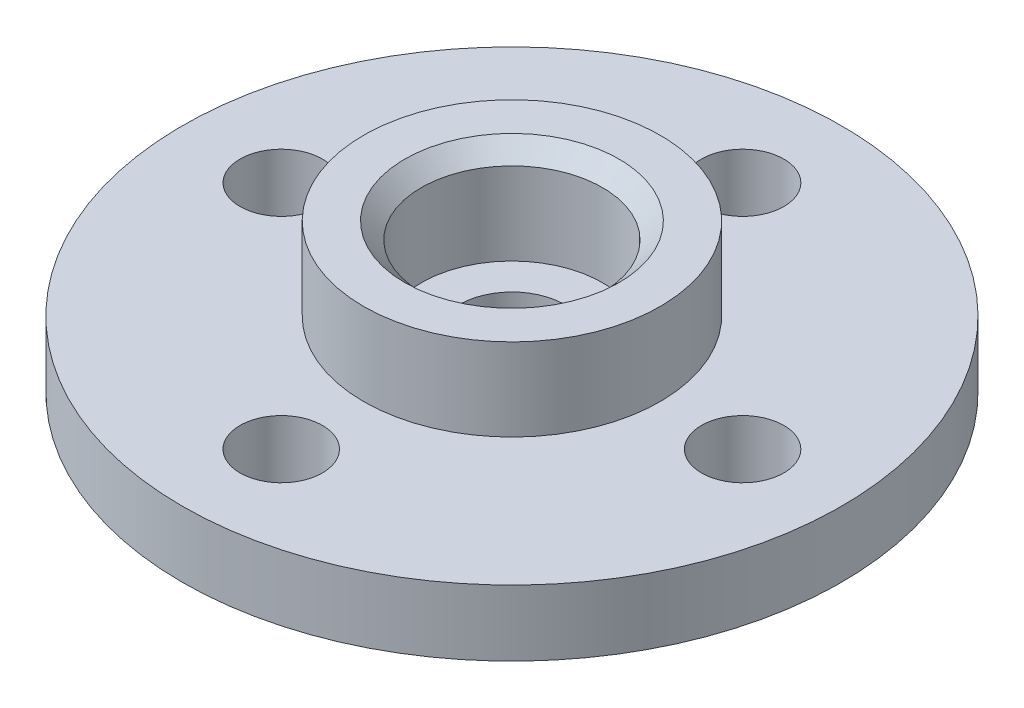
ISO-10303-21;
HEADER;
FILE_DESCRIPTION(('STEP AP214'),'2;1');
FILE_NAME('part.step','',(''),(''),'','','');
FILE_SCHEMA(('AUTOMOTIVE_DESIGN { 1 0 10303 214 1 1 1 1 }'));
ENDSEC;
DATA;
#1=APPLICATION_CONTEXT('core data for automotive mechanical design processes');
#2=APPLICATION_PROTOCOL_DEFINITION('international standard','automotive_design',2000,#1);
#3=PRODUCT_CONTEXT('',#1,'mechanical');
#4=PRODUCT('Part','Part','',(#3));
#5=PRODUCT_RELATED_PRODUCT_CATEGORY('part','',(#4));
#6=PRODUCT_DEFINITION_FORMATION('','',#4);
#7=PRODUCT_DEFINITION_CONTEXT('part definition',#1,'design');
#8=PRODUCT_DEFINITION('design','',#6,#7);
#9=PRODUCT_DEFINITION_SHAPE('','',#8);
#10=(LENGTH_UNIT() NAMED_UNIT(*) SI_UNIT(.MILLI.,.METRE.));
#11=(NAMED_UNIT(*) PLANE_ANGLE_UNIT() SI_UNIT($,.RADIAN.));
#12=(NAMED_UNIT(*) SI_UNIT($,.STERADIAN.) SOLID_ANGLE_UNIT());
#13=UNCERTAINTY_MEASURE_WITH_UNIT(LENGTH_MEASURE(1.E-05),#10,'distance_accuracy_value','');
#14=(GEOMETRIC_REPRESENTATION_CONTEXT(3) GLOBAL_UNCERTAINTY_ASSIGNED_CONTEXT((#13)) GLOBAL_UNIT_ASSIGNED_CONTEXT((#10,
#11,#12)) REPRESENTATION_CONTEXT('',''));
#15=CARTESIAN_POINT('',(0.,0.,0.));
#16=DIRECTION('',(0.,0.,1.));
#17=DIRECTION('',(1.,0.,0.));
#18=AXIS2_PLACEMENT_3D('',#15,#16,#17);
#19=CARTESIAN_POINT('',(0.,2.,0.));
#20=DIRECTION('',(0.,-1.,0.));
#21=DIRECTION('',(0.,0.,-1.));
#22=AXIS2_PLACEMENT_3D('',#19,#20,#21);
#23=CYLINDRICAL_SURFACE('',#22,10.);
#24=CARTESIAN_POINT('',(0.,2.,0.));
#25=DIRECTION('',(0.,1.,0.));
#26=DIRECTION('',(0.,0.,1.));
#27=AXIS2_PLACEMENT_3D('',#24,#25,#26);
#28=CIRCLE('',#27,10.);
#29=CARTESIAN_POINT('',(0.,2.,10.));
#30=VERTEX_POINT('',#29);
#31=EDGE_CURVE('E59',#30,#30,#28,.T.);
#32=ORIENTED_EDGE('',*,*,#31,.F.);
#33=EDGE_LOOP('',(#32));
#34=FACE_BOUND('',#33,.T.);
#35=CARTESIAN_POINT('',(0.,0.,0.));
#36=DIRECTION('',(0.,1.,0.));
#37=DIRECTION('',(0.,0.,1.));
#38=AXIS2_PLACEMENT_3D('',#35,#36,#37);
#39=CIRCLE('',#38,10.);
#40=CARTESIAN_POINT('',(0.,0.,10.));
#41=VERTEX_POINT('',#40);
#42=EDGE_CURVE('E81',#41,#41,#39,.T.);
#43=ORIENTED_EDGE('',*,*,#42,.T.);
#44=EDGE_LOOP('',(#43));
#45=FACE_BOUND('',#44,.T.);
#46=ADVANCED_FACE('F43',(#34,#45),#23,.T.);
#47=CARTESIAN_POINT('',(0.,2.,0.));
#48=DIRECTION('',(0.,1.,0.));
#49=DIRECTION('',(0.,0.,1.));
#50=AXIS2_PLACEMENT_3D('',#47,#48,#49);
#51=PLANE('',#50);
#52=CARTESIAN_POINT('',(0.,2.,-7.));
#53=DIRECTION('',(0.,1.,0.));
#54=DIRECTION('',(0.,0.,1.));
#55=AXIS2_PLACEMENT_3D('',#52,#53,#54);
#56=CIRCLE('',#55,1.25);
#57=CARTESIAN_POINT('',(0.,2.,-5.75));
#58=VERTEX_POINT('',#57);
#59=EDGE_CURVE('E80',#58,#58,#56,.T.);
#60=ORIENTED_EDGE('',*,*,#59,.F.);
#61=EDGE_LOOP('',(#60));
#62=FACE_BOUND('',#61,.T.);
#63=CARTESIAN_POINT('',(7.,2.,0.));
#64=DIRECTION('',(0.,1.,0.));
#65=DIRECTION('',(0.,0.,1.));
#66=AXIS2_PLACEMENT_3D('',#63,#64,#65);
#67=CIRCLE('',#66,1.25);
#68=CARTESIAN_POINT('',(7.,2.,1.25));
#69=VERTEX_POINT('',#68);
#70=EDGE_CURVE('E94',#69,#69,#67,.T.);
#71=ORIENTED_EDGE('',*,*,#70,.F.);
#72=EDGE_LOOP('',(#71));
#73=FACE_BOUND('',#72,.T.);
#74=CARTESIAN_POINT('',(0.,2.,7.));
#75=DIRECTION('',(0.,1.,0.));
#76=DIRECTION('',(0.,0.,1.));
#77=AXIS2_PLACEMENT_3D('',#74,#75,#76);
#78=CIRCLE('',#77,1.25);
#79=CARTESIAN_POINT('',(0.,2.,8.25));
#80=VERTEX_POINT('',#79);
#81=EDGE_CURVE('E91',#80,#80,#78,.T.);
#82=ORIENTED_EDGE('',*,*,#81,.F.);
#83=EDGE_LOOP('',(#82));
#84=FACE_BOUND('',#83,.T.);
#85=CARTESIAN_POINT('',(-7.,2.,0.));
#86=DIRECTION('',(0.,1.,0.));
#87=DIRECTION('',(0.,0.,1.));
#88=AXIS2_PLACEMENT_3D('',#85,#86,#87);
#89=CIRCLE('',#88,1.25);
#90=CARTESIAN_POINT('',(-7.,2.,1.25));
#91=VERTEX_POINT('',#90);
#92=EDGE_CURVE('E88',#91,#91,#89,.T.);
#93=ORIENTED_EDGE('',*,*,#92,.F.);
#94=EDGE_LOOP('',(#93));
#95=FACE_BOUND('',#94,.T.);
#96=CARTESIAN_POINT('',(0.,2.,0.));
#97=DIRECTION('',(0.,1.,0.));
#98=DIRECTION('',(0.,0.,1.));
#99=AXIS2_PLACEMENT_3D('',#96,#97,#98);
#100=CIRCLE('',#99,4.5);
#101=CARTESIAN_POINT('',(0.,2.,4.5));
#102=VERTEX_POINT('',#101);
#103=EDGE_CURVE('E55',#102,#102,#100,.T.);
#104=ORIENTED_EDGE('',*,*,#103,.F.);
#105=EDGE_LOOP('',(#104));
#106=FACE_BOUND('',#105,.T.);
#107=ORIENTED_EDGE('',*,*,#31,.T.);
#108=EDGE_LOOP('',(#107));
#109=FACE_BOUND('',#108,.T.);
#110=ADVANCED_FACE('F126',(#62,#73,#84,#95,#106,#109),#51,.T.);
#111=CARTESIAN_POINT('',(0.,0.,0.));
#112=DIRECTION('',(0.,1.,0.));
#113=DIRECTION('',(0.,0.,1.));
#114=AXIS2_PLACEMENT_3D('',#111,#112,#113);
#115=PLANE('',#114);
#116=CARTESIAN_POINT('',(0.,0.,0.));
#117=DIRECTION('',(0.,1.,0.));
#118=DIRECTION('',(0.,0.,1.));
#119=AXIS2_PLACEMENT_3D('',#116,#117,#118);
#120=CIRCLE('',#119,1.6);
#121=CARTESIAN_POINT('',(0.,0.,1.6));
#122=VERTEX_POINT('',#121);
#123=EDGE_CURVE('E62',#122,#122,#120,.T.);
#124=ORIENTED_EDGE('',*,*,#123,.T.);
#125=EDGE_LOOP('',(#124));
#126=FACE_BOUND('',#125,.T.);
#127=CARTESIAN_POINT('',(0.,0.,-7.));
#128=DIRECTION('',(0.,1.,0.));
#129=DIRECTION('',(0.,0.,1.));
#130=AXIS2_PLACEMENT_3D('',#127,#128,#129);
#131=CIRCLE('',#130,1.25);
#132=CARTESIAN_POINT('',(0.,0.,-5.75));
#133=VERTEX_POINT('',#132);
#134=EDGE_CURVE('E67',#133,#133,#131,.T.);
#135=ORIENTED_EDGE('',*,*,#134,.T.);
#136=EDGE_LOOP('',(#135));
#137=FACE_BOUND('',#136,.T.);
#138=CARTESIAN_POINT('',(7.,0.,0.));
#139=DIRECTION('',(0.,1.,0.));
#140=DIRECTION('',(0.,0.,1.));
#141=AXIS2_PLACEMENT_3D('',#138,#139,#140);
#142=CIRCLE('',#141,1.25);
#143=CARTESIAN_POINT('',(7.,0.,1.25));
#144=VERTEX_POINT('',#143);
#145=EDGE_CURVE('E71',#144,#144,#142,.T.);
#146=ORIENTED_EDGE('',*,*,#145,.T.);
#147=EDGE_LOOP('',(#146));
#148=FACE_BOUND('',#147,.T.);
#149=CARTESIAN_POINT('',(0.,0.,7.));
#150=DIRECTION('',(0.,1.,0.));
#151=DIRECTION('',(0.,0.,1.));
#152=AXIS2_PLACEMENT_3D('',#149,#150,#151);
#153=CIRCLE('',#152,1.25);
#154=CARTESIAN_POINT('',(0.,0.,8.25));
#155=VERTEX_POINT('',#154);
#156=EDGE_CURVE('E74',#155,#155,#153,.T.);
#157=ORIENTED_EDGE('',*,*,#156,.T.);
#158=EDGE_LOOP('',(#157));
#159=FACE_BOUND('',#158,.T.);
#160=CARTESIAN_POINT('',(-7.,0.,0.));
#161=DIRECTION('',(0.,1.,0.));
#162=DIRECTION('',(0.,0.,1.));
#163=AXIS2_PLACEMENT_3D('',#160,#161,#162);
#164=CIRCLE('',#163,1.25);
#165=CARTESIAN_POINT('',(-7.,0.,1.25));
#166=VERTEX_POINT('',#165);
#167=EDGE_CURVE('E77',#166,#166,#164,.T.);
#168=ORIENTED_EDGE('',*,*,#167,.T.);
#169=EDGE_LOOP('',(#168));
#170=FACE_BOUND('',#169,.T.);
#171=ORIENTED_EDGE('',*,*,#42,.F.);
#172=EDGE_LOOP('',(#171));
#173=FACE_BOUND('',#172,.T.);
#174=ADVANCED_FACE('F132',(#126,#137,#148,#159,#170,#173),#115,.F.);
#175=CARTESIAN_POINT('',(0.,4.5,0.));
#176=DIRECTION('',(0.,-1.,0.));
#177=DIRECTION('',(0.,0.,-1.));
#178=AXIS2_PLACEMENT_3D('',#175,#176,#177);
#179=CYLINDRICAL_SURFACE('',#178,4.5);
#180=CARTESIAN_POINT('',(0.,4.5,0.));
#181=DIRECTION('',(0.,1.,0.));
#182=DIRECTION('',(0.,0.,1.));
#183=AXIS2_PLACEMENT_3D('',#180,#181,#182);
#184=CIRCLE('',#183,4.5);
#185=CARTESIAN_POINT('',(0.,4.5,4.5));
#186=VERTEX_POINT('',#185);
#187=EDGE_CURVE('E70',#186,#186,#184,.T.);
#188=ORIENTED_EDGE('',*,*,#187,.F.);
#189=EDGE_LOOP('',(#188));
#190=FACE_BOUND('',#189,.T.);
#191=ORIENTED_EDGE('',*,*,#103,.T.);
#192=EDGE_LOOP('',(#191));
#193=FACE_BOUND('',#192,.T.);
#194=ADVANCED_FACE('F139',(#190,#193),#179,.T.);
#195=CARTESIAN_POINT('',(0.,4.5,0.));
#196=DIRECTION('',(0.,1.,0.));
#197=DIRECTION('',(0.,0.,1.));
#198=AXIS2_PLACEMENT_3D('',#195,#196,#197);
#199=PLANE('',#198);
#200=CARTESIAN_POINT('',(0.,4.5,0.));
#201=DIRECTION('',(0.,1.,0.));
#202=DIRECTION('',(0.,0.,1.));
#203=AXIS2_PLACEMENT_3D('',#200,#201,#202);
#204=CIRCLE('',#203,3.25000000000001);
#205=CARTESIAN_POINT('',(0.,4.5,3.25000000000001));
#206=VERTEX_POINT('',#205);
#207=EDGE_CURVE('E10',#206,#206,#204,.F.);
#208=ORIENTED_EDGE('',*,*,#207,.T.);
#209=EDGE_LOOP('',(#208));
#210=FACE_BOUND('',#209,.T.);
#211=ORIENTED_EDGE('',*,*,#187,.T.);
#212=EDGE_LOOP('',(#211));
#213=FACE_BOUND('',#212,.T.);
#214=ADVANCED_FACE('F143',(#210,#213),#199,.T.);
#215=CARTESIAN_POINT('',(-7.,-0.5,0.));
#216=DIRECTION('',(0.,1.,0.));
#217=DIRECTION('',(0.,0.,1.));
#218=AXIS2_PLACEMENT_3D('',#215,#216,#217);
#219=CYLINDRICAL_SURFACE('',#218,1.25);
#220=ORIENTED_EDGE('',*,*,#92,.T.);
#221=EDGE_LOOP('',(#220));
#222=FACE_BOUND('',#221,.T.);
#223=ORIENTED_EDGE('',*,*,#167,.F.);
#224=EDGE_LOOP('',(#223));
#225=FACE_BOUND('',#224,.T.);
#226=ADVANCED_FACE('F146',(#222,#225),#219,.F.);
#227=CARTESIAN_POINT('',(0.,-0.5,7.));
#228=DIRECTION('',(0.,1.,0.));
#229=DIRECTION('',(0.,0.,1.));
#230=AXIS2_PLACEMENT_3D('',#227,#228,#229);
#231=CYLINDRICAL_SURFACE('',#230,1.25);
#232=ORIENTED_EDGE('',*,*,#81,.T.);
#233=EDGE_LOOP('',(#232));
#234=FACE_BOUND('',#233,.T.);
#235=ORIENTED_EDGE('',*,*,#156,.F.);
#236=EDGE_LOOP('',(#235));
#237=FACE_BOUND('',#236,.T.);
#238=ADVANCED_FACE('F149',(#234,#237),#231,.F.);
#239=CARTESIAN_POINT('',(7.,-0.5,0.));
#240=DIRECTION('',(0.,1.,0.));
#241=DIRECTION('',(0.,0.,1.));
#242=AXIS2_PLACEMENT_3D('',#239,#240,#241);
#243=CYLINDRICAL_SURFACE('',#242,1.25);
#244=ORIENTED_EDGE('',*,*,#70,.T.);
#245=EDGE_LOOP('',(#244));
#246=FACE_BOUND('',#245,.T.);
#247=ORIENTED_EDGE('',*,*,#145,.F.);
#248=EDGE_LOOP('',(#247));
#249=FACE_BOUND('',#248,.T.);
#250=ADVANCED_FACE('F122',(#246,#249),#243,.F.);
#251=CARTESIAN_POINT('',(0.,-0.5,-7.));
#252=DIRECTION('',(0.,1.,0.));
#253=DIRECTION('',(0.,0.,1.));
#254=AXIS2_PLACEMENT_3D('',#251,#252,#253);
#255=CYLINDRICAL_SURFACE('',#254,1.25);
#256=ORIENTED_EDGE('',*,*,#59,.T.);
#257=EDGE_LOOP('',(#256));
#258=FACE_BOUND('',#257,.T.);
#259=ORIENTED_EDGE('',*,*,#134,.F.);
#260=EDGE_LOOP('',(#259));
#261=FACE_BOUND('',#260,.T.);
#262=ADVANCED_FACE('F115',(#258,#261),#255,.F.);
#263=CARTESIAN_POINT('',(0.,1.5,0.));
#264=DIRECTION('',(0.,1.,0.));
#265=DIRECTION('',(0.,0.,1.));
#266=AXIS2_PLACEMENT_3D('',#263,#264,#265);
#267=CYLINDRICAL_SURFACE('',#266,2.75);
#268=CARTESIAN_POINT('',(0.,3.99999999999999,0.));
#269=DIRECTION('',(0.,1.,0.));
#270=DIRECTION('',(0.,0.,1.));
#271=AXIS2_PLACEMENT_3D('',#268,#269,#270);
#272=CIRCLE('',#271,2.75);
#273=CARTESIAN_POINT('',(0.,3.99999999999999,2.75));
#274=VERTEX_POINT('',#273);
#275=EDGE_CURVE('E51',#274,#274,#272,.T.);
#276=ORIENTED_EDGE('',*,*,#275,.T.);
#277=EDGE_LOOP('',(#276));
#278=FACE_BOUND('',#277,.T.);
#279=CARTESIAN_POINT('',(0.,1.5,0.));
#280=DIRECTION('',(0.,1.,0.));
#281=DIRECTION('',(0.,0.,1.));
#282=AXIS2_PLACEMENT_3D('',#279,#280,#281);
#283=CIRCLE('',#282,2.75);
#284=CARTESIAN_POINT('',(0.,1.5,2.75));
#285=VERTEX_POINT('',#284);
#286=EDGE_CURVE('E65',#285,#285,#283,.T.);
#287=ORIENTED_EDGE('',*,*,#286,.F.);
#288=EDGE_LOOP('',(#287));
#289=FACE_BOUND('',#288,.T.);
#290=ADVANCED_FACE('F110',(#278,#289),#267,.F.);
#291=CARTESIAN_POINT('',(0.,1.5,0.));
#292=DIRECTION('',(0.,1.,0.));
#293=DIRECTION('',(0.,0.,1.));
#294=AXIS2_PLACEMENT_3D('',#291,#292,#293);
#295=PLANE('',#294);
#296=CARTESIAN_POINT('',(0.,1.5,0.));
#297=DIRECTION('',(0.,1.,0.));
#298=DIRECTION('',(0.,0.,1.));
#299=AXIS2_PLACEMENT_3D('',#296,#297,#298);
#300=CIRCLE('',#299,1.6);
#301=CARTESIAN_POINT('',(0.,1.5,1.6));
#302=VERTEX_POINT('',#301);
#303=EDGE_CURVE('E66',#302,#302,#300,.T.);
#304=ORIENTED_EDGE('',*,*,#303,.F.);
#305=EDGE_LOOP('',(#304));
#306=FACE_BOUND('',#305,.T.);
#307=ORIENTED_EDGE('',*,*,#286,.T.);
#308=EDGE_LOOP('',(#307));
#309=FACE_BOUND('',#308,.T.);
#310=ADVANCED_FACE('F107',(#306,#309),#295,.T.);
#311=CARTESIAN_POINT('',(0.,-1.5,0.));
#312=DIRECTION('',(0.,1.,0.));
#313=DIRECTION('',(0.,0.,1.));
#314=AXIS2_PLACEMENT_3D('',#311,#312,#313);
#315=CYLINDRICAL_SURFACE('',#314,1.6);
#316=ORIENTED_EDGE('',*,*,#303,.T.);
#317=EDGE_LOOP('',(#316));
#318=FACE_BOUND('',#317,.T.);
#319=ORIENTED_EDGE('',*,*,#123,.F.);
#320=EDGE_LOOP('',(#319));
#321=FACE_BOUND('',#320,.T.);
#322=ADVANCED_FACE('F104',(#318,#321),#315,.F.);
#323=CARTESIAN_POINT('',(0.,3.99999999999999,0.));
#324=DIRECTION('',(0.,1.,0.));
#325=DIRECTION('',(0.,0.,1.));
#326=AXIS2_PLACEMENT_3D('',#323,#324,#325);
#327=CONICAL_SURFACE('',#326,2.75,0.785398163397449);
#328=ORIENTED_EDGE('',*,*,#207,.F.);
#329=EDGE_LOOP('',(#328));
#330=FACE_BOUND('',#329,.T.);
#331=ORIENTED_EDGE('',*,*,#275,.F.);
#332=EDGE_LOOP('',(#331));
#333=FACE_BOUND('',#332,.T.);
#334=ADVANCED_FACE('F46',(#330,#333),#327,.F.);
#335=CLOSED_SHELL('',(#46,#110,#174,#194,#214,#226,#238,#250,#262,#290,#310,#322,#334));
#336=MANIFOLD_SOLID_BREP('B2',#335);
#337=ADVANCED_BREP_SHAPE_REPRESENTATION('',(#18,#336),#14);
#338=SHAPE_DEFINITION_REPRESENTATION(#9,#337);
ENDSEC;
END-ISO-10303-21;
